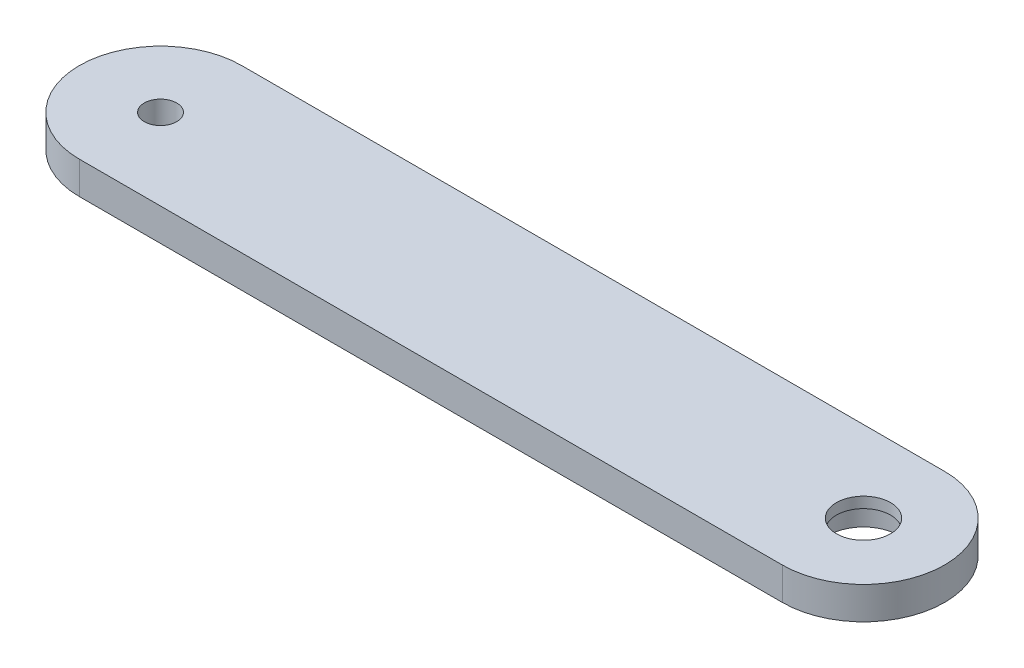
ISO-10303-21;
HEADER;
FILE_DESCRIPTION(('STEP AP214'),'2;1');
FILE_NAME('part.step','',(''),(''),'','','');
FILE_SCHEMA(('AUTOMOTIVE_DESIGN { 1 0 10303 214 1 1 1 1 }'));
ENDSEC;
DATA;
#1=APPLICATION_CONTEXT('core data for automotive mechanical design processes');
#2=APPLICATION_PROTOCOL_DEFINITION('international standard','automotive_design',2000,#1);
#3=PRODUCT_CONTEXT('',#1,'mechanical');
#4=PRODUCT('Part','Part','',(#3));
#5=PRODUCT_RELATED_PRODUCT_CATEGORY('part','',(#4));
#6=PRODUCT_DEFINITION_FORMATION('','',#4);
#7=PRODUCT_DEFINITION_CONTEXT('part definition',#1,'design');
#8=PRODUCT_DEFINITION('design','',#6,#7);
#9=PRODUCT_DEFINITION_SHAPE('','',#8);
#10=(LENGTH_UNIT() NAMED_UNIT(*) SI_UNIT(.MILLI.,.METRE.));
#11=(NAMED_UNIT(*) PLANE_ANGLE_UNIT() SI_UNIT($,.RADIAN.));
#12=(NAMED_UNIT(*) SI_UNIT($,.STERADIAN.) SOLID_ANGLE_UNIT());
#13=UNCERTAINTY_MEASURE_WITH_UNIT(LENGTH_MEASURE(1.E-05),#10,'distance_accuracy_value','');
#14=(GEOMETRIC_REPRESENTATION_CONTEXT(3) GLOBAL_UNCERTAINTY_ASSIGNED_CONTEXT((#13)) GLOBAL_UNIT_ASSIGNED_CONTEXT((#10,
#11,#12)) REPRESENTATION_CONTEXT('',''));
#15=CARTESIAN_POINT('',(0.,0.,0.));
#16=DIRECTION('',(0.,0.,1.));
#17=DIRECTION('',(1.,0.,0.));
#18=AXIS2_PLACEMENT_3D('',#15,#16,#17);
#19=CARTESIAN_POINT('',(123.5,6.,-13.5000000000001));
#20=DIRECTION('',(0.,-1.,0.));
#21=DIRECTION('',(0.,0.,-1.));
#22=AXIS2_PLACEMENT_3D('',#19,#20,#21);
#23=CYLINDRICAL_SURFACE('',#22,5.);
#24=CARTESIAN_POINT('',(123.5,6.,-13.5000000000001));
#25=DIRECTION('',(0.,1.,0.));
#26=DIRECTION('',(0.,0.,1.));
#27=AXIS2_PLACEMENT_3D('',#24,#25,#26);
#28=CIRCLE('',#27,5.);
#29=CARTESIAN_POINT('',(123.5,6.,-8.50000000000008));
#30=VERTEX_POINT('',#29);
#31=EDGE_CURVE('E137',#30,#30,#28,.T.);
#32=ORIENTED_EDGE('',*,*,#31,.T.);
#33=EDGE_LOOP('',(#32));
#34=FACE_BOUND('',#33,.T.);
#35=CARTESIAN_POINT('',(123.5,4.,-13.5000000000001));
#36=DIRECTION('',(0.,-1.,0.));
#37=DIRECTION('',(0.,0.,-1.));
#38=AXIS2_PLACEMENT_3D('',#35,#36,#37);
#39=CIRCLE('',#38,5.);
#40=CARTESIAN_POINT('',(123.5,4.,-18.5000000000001));
#41=VERTEX_POINT('',#40);
#42=EDGE_CURVE('E43',#41,#41,#39,.T.);
#43=ORIENTED_EDGE('',*,*,#42,.T.);
#44=EDGE_LOOP('',(#43));
#45=FACE_BOUND('',#44,.T.);
#46=ADVANCED_FACE('F39',(#34,#45),#23,.F.);
#47=CARTESIAN_POINT('',(123.5,6.,-13.5000000000001));
#48=DIRECTION('',(0.,1.,0.));
#49=DIRECTION('',(0.,0.,1.));
#50=AXIS2_PLACEMENT_3D('',#47,#48,#49);
#51=PLANE('',#50);
#52=CARTESIAN_POINT('',(-6.50000000000001,6.,-13.5));
#53=DIRECTION('',(0.,1.,0.));
#54=DIRECTION('',(0.,0.,1.));
#55=AXIS2_PLACEMENT_3D('',#52,#53,#54);
#56=CIRCLE('',#55,3.);
#57=CARTESIAN_POINT('',(-6.50000000000001,6.,-10.5));
#58=VERTEX_POINT('',#57);
#59=EDGE_CURVE('E115',#58,#58,#56,.T.);
#60=ORIENTED_EDGE('',*,*,#59,.F.);
#61=EDGE_LOOP('',(#60));
#62=FACE_BOUND('',#61,.T.);
#63=CARTESIAN_POINT('',(123.5,6.,-13.5000000000001));
#64=DIRECTION('',(0.,1.,0.));
#65=DIRECTION('',(0.,0.,1.));
#66=AXIS2_PLACEMENT_3D('',#63,#64,#65);
#67=CIRCLE('',#66,15.);
#68=CARTESIAN_POINT('',(123.5,6.,1.49999999999992));
#69=VERTEX_POINT('',#68);
#70=CARTESIAN_POINT('',(123.5,6.,-28.5000000000001));
#71=VERTEX_POINT('',#70);
#72=EDGE_CURVE('E94',#69,#71,#67,.T.);
#73=ORIENTED_EDGE('',*,*,#72,.T.);
#74=DIRECTION('',(-1.,0.,0.));
#75=VECTOR('',#74,1.);
#76=CARTESIAN_POINT('',(-6.50000000000001,6.,-28.5));
#77=LINE('',#76,#75);
#78=CARTESIAN_POINT('',(-6.50000000000001,6.,-28.5));
#79=VERTEX_POINT('',#78);
#80=EDGE_CURVE('E88',#71,#79,#77,.T.);
#81=ORIENTED_EDGE('',*,*,#80,.T.);
#82=CARTESIAN_POINT('',(-6.50000000000001,6.,-13.5));
#83=DIRECTION('',(0.,1.,0.));
#84=DIRECTION('',(0.,0.,1.));
#85=AXIS2_PLACEMENT_3D('',#82,#83,#84);
#86=CIRCLE('',#85,15.);
#87=CARTESIAN_POINT('',(-6.5,6.,1.5));
#88=VERTEX_POINT('',#87);
#89=EDGE_CURVE('E92',#79,#88,#86,.T.);
#90=ORIENTED_EDGE('',*,*,#89,.T.);
#91=DIRECTION('',(1.,0.,0.));
#92=VECTOR('',#91,1.);
#93=CARTESIAN_POINT('',(-6.5,6.,1.5));
#94=LINE('',#93,#92);
#95=EDGE_CURVE('E58',#88,#69,#94,.T.);
#96=ORIENTED_EDGE('',*,*,#95,.T.);
#97=EDGE_LOOP('',(#73,#81,#90,#96));
#98=FACE_BOUND('',#97,.T.);
#99=ORIENTED_EDGE('',*,*,#31,.F.);
#100=EDGE_LOOP('',(#99));
#101=FACE_BOUND('',#100,.T.);
#102=ADVANCED_FACE('F89',(#62,#98,#101),#51,.T.);
#103=CARTESIAN_POINT('',(123.5,0.,-13.5000000000001));
#104=DIRECTION('',(0.,1.,0.));
#105=DIRECTION('',(0.,0.,1.));
#106=AXIS2_PLACEMENT_3D('',#103,#104,#105);
#107=PLANE('',#106);
#108=CARTESIAN_POINT('',(123.5,0.,-13.5000000000001));
#109=DIRECTION('',(0.,-1.,0.));
#110=DIRECTION('',(0.,0.,-1.));
#111=AXIS2_PLACEMENT_3D('',#108,#109,#110);
#112=CIRCLE('',#111,6.5);
#113=CARTESIAN_POINT('',(123.5,0.,-20.0000000000001));
#114=VERTEX_POINT('',#113);
#115=EDGE_CURVE('E144',#114,#114,#112,.T.);
#116=ORIENTED_EDGE('',*,*,#115,.F.);
#117=EDGE_LOOP('',(#116));
#118=FACE_BOUND('',#117,.T.);
#119=CARTESIAN_POINT('',(123.5,0.,-13.5000000000001));
#120=DIRECTION('',(0.,1.,0.));
#121=DIRECTION('',(0.,0.,1.));
#122=AXIS2_PLACEMENT_3D('',#119,#120,#121);
#123=CIRCLE('',#122,15.);
#124=CARTESIAN_POINT('',(123.5,0.,1.49999999999992));
#125=VERTEX_POINT('',#124);
#126=CARTESIAN_POINT('',(123.5,0.,-28.5000000000001));
#127=VERTEX_POINT('',#126);
#128=EDGE_CURVE('E111',#125,#127,#123,.T.);
#129=ORIENTED_EDGE('',*,*,#128,.F.);
#130=DIRECTION('',(1.,0.,0.));
#131=VECTOR('',#130,1.);
#132=CARTESIAN_POINT('',(-6.5,0.,1.5));
#133=LINE('',#132,#131);
#134=CARTESIAN_POINT('',(-6.5,0.,1.5));
#135=VERTEX_POINT('',#134);
#136=EDGE_CURVE('E81',#135,#125,#133,.T.);
#137=ORIENTED_EDGE('',*,*,#136,.F.);
#138=CARTESIAN_POINT('',(-6.50000000000001,0.,-13.5));
#139=DIRECTION('',(0.,1.,0.));
#140=DIRECTION('',(0.,0.,1.));
#141=AXIS2_PLACEMENT_3D('',#138,#139,#140);
#142=CIRCLE('',#141,15.);
#143=CARTESIAN_POINT('',(-6.50000000000001,0.,-28.5));
#144=VERTEX_POINT('',#143);
#145=EDGE_CURVE('E75',#144,#135,#142,.T.);
#146=ORIENTED_EDGE('',*,*,#145,.F.);
#147=DIRECTION('',(-1.,0.,0.));
#148=VECTOR('',#147,1.);
#149=CARTESIAN_POINT('',(-6.50000000000001,0.,-28.5));
#150=LINE('',#149,#148);
#151=EDGE_CURVE('E99',#127,#144,#150,.T.);
#152=ORIENTED_EDGE('',*,*,#151,.F.);
#153=EDGE_LOOP('',(#129,#137,#146,#152));
#154=FACE_BOUND('',#153,.T.);
#155=CARTESIAN_POINT('',(-6.50000000000001,0.,-13.5));
#156=DIRECTION('',(0.,1.,0.));
#157=DIRECTION('',(0.,0.,1.));
#158=AXIS2_PLACEMENT_3D('',#155,#156,#157);
#159=CIRCLE('',#158,3.);
#160=CARTESIAN_POINT('',(-6.50000000000001,0.,-10.5));
#161=VERTEX_POINT('',#160);
#162=EDGE_CURVE('E133',#161,#161,#159,.T.);
#163=ORIENTED_EDGE('',*,*,#162,.T.);
#164=EDGE_LOOP('',(#163));
#165=FACE_BOUND('',#164,.T.);
#166=ADVANCED_FACE('F128',(#118,#154,#165),#107,.F.);
#167=CARTESIAN_POINT('',(123.5,6.,-13.5000000000001));
#168=DIRECTION('',(0.,-1.,0.));
#169=DIRECTION('',(0.,0.,-1.));
#170=AXIS2_PLACEMENT_3D('',#167,#168,#169);
#171=CYLINDRICAL_SURFACE('',#170,15.);
#172=ORIENTED_EDGE('',*,*,#128,.T.);
#173=DIRECTION('',(0.,-1.,0.));
#174=VECTOR('',#173,1.);
#175=CARTESIAN_POINT('',(123.5,6.,-28.5000000000001));
#176=LINE('',#175,#174);
#177=EDGE_CURVE('E11',#71,#127,#176,.T.);
#178=ORIENTED_EDGE('',*,*,#177,.F.);
#179=ORIENTED_EDGE('',*,*,#72,.F.);
#180=DIRECTION('',(0.,-1.,0.));
#181=VECTOR('',#180,1.);
#182=CARTESIAN_POINT('',(123.5,6.,1.49999999999992));
#183=LINE('',#182,#181);
#184=EDGE_CURVE('E107',#69,#125,#183,.T.);
#185=ORIENTED_EDGE('',*,*,#184,.T.);
#186=EDGE_LOOP('',(#172,#178,#179,#185));
#187=FACE_BOUND('',#186,.T.);
#188=ADVANCED_FACE('F41',(#187),#171,.T.);
#189=CARTESIAN_POINT('',(-6.50000000000001,6.,-28.5));
#190=DIRECTION('',(0.,0.,1.));
#191=DIRECTION('',(1.,0.,0.));
#192=AXIS2_PLACEMENT_3D('',#189,#190,#191);
#193=PLANE('',#192);
#194=ORIENTED_EDGE('',*,*,#151,.T.);
#195=DIRECTION('',(0.,-1.,0.));
#196=VECTOR('',#195,1.);
#197=CARTESIAN_POINT('',(-6.50000000000001,6.,-28.5));
#198=LINE('',#197,#196);
#199=EDGE_CURVE('E50',#79,#144,#198,.T.);
#200=ORIENTED_EDGE('',*,*,#199,.F.);
#201=ORIENTED_EDGE('',*,*,#80,.F.);
#202=ORIENTED_EDGE('',*,*,#177,.T.);
#203=EDGE_LOOP('',(#194,#200,#201,#202));
#204=FACE_BOUND('',#203,.T.);
#205=ADVANCED_FACE('F98',(#204),#193,.F.);
#206=CARTESIAN_POINT('',(-6.50000000000001,6.,-13.5));
#207=DIRECTION('',(0.,-1.,0.));
#208=DIRECTION('',(0.,0.,-1.));
#209=AXIS2_PLACEMENT_3D('',#206,#207,#208);
#210=CYLINDRICAL_SURFACE('',#209,15.);
#211=ORIENTED_EDGE('',*,*,#145,.T.);
#212=DIRECTION('',(0.,-1.,0.));
#213=VECTOR('',#212,1.);
#214=CARTESIAN_POINT('',(-6.5,6.,1.5));
#215=LINE('',#214,#213);
#216=EDGE_CURVE('E101',#88,#135,#215,.T.);
#217=ORIENTED_EDGE('',*,*,#216,.F.);
#218=ORIENTED_EDGE('',*,*,#89,.F.);
#219=ORIENTED_EDGE('',*,*,#199,.T.);
#220=EDGE_LOOP('',(#211,#217,#218,#219));
#221=FACE_BOUND('',#220,.T.);
#222=ADVANCED_FACE('F103',(#221),#210,.T.);
#223=CARTESIAN_POINT('',(-6.5,6.,1.5));
#224=DIRECTION('',(0.,0.,-1.));
#225=DIRECTION('',(-1.,0.,0.));
#226=AXIS2_PLACEMENT_3D('',#223,#224,#225);
#227=PLANE('',#226);
#228=ORIENTED_EDGE('',*,*,#136,.T.);
#229=ORIENTED_EDGE('',*,*,#184,.F.);
#230=ORIENTED_EDGE('',*,*,#95,.F.);
#231=ORIENTED_EDGE('',*,*,#216,.T.);
#232=EDGE_LOOP('',(#228,#229,#230,#231));
#233=FACE_BOUND('',#232,.T.);
#234=ADVANCED_FACE('F125',(#233),#227,.F.);
#235=CARTESIAN_POINT('',(-6.50000000000001,6.,-13.5));
#236=DIRECTION('',(0.,-1.,0.));
#237=DIRECTION('',(0.,0.,-1.));
#238=AXIS2_PLACEMENT_3D('',#235,#236,#237);
#239=CYLINDRICAL_SURFACE('',#238,3.);
#240=ORIENTED_EDGE('',*,*,#59,.T.);
#241=EDGE_LOOP('',(#240));
#242=FACE_BOUND('',#241,.T.);
#243=ORIENTED_EDGE('',*,*,#162,.F.);
#244=EDGE_LOOP('',(#243));
#245=FACE_BOUND('',#244,.T.);
#246=ADVANCED_FACE('F165',(#242,#245),#239,.F.);
#247=CARTESIAN_POINT('',(123.5,4.,-13.5000000000001));
#248=DIRECTION('',(0.,-1.,0.));
#249=DIRECTION('',(0.,0.,-1.));
#250=AXIS2_PLACEMENT_3D('',#247,#248,#249);
#251=CYLINDRICAL_SURFACE('',#250,6.5);
#252=CARTESIAN_POINT('',(123.5,4.,-13.5000000000001));
#253=DIRECTION('',(0.,-1.,0.));
#254=DIRECTION('',(0.,0.,-1.));
#255=AXIS2_PLACEMENT_3D('',#252,#253,#254);
#256=CIRCLE('',#255,6.5);
#257=CARTESIAN_POINT('',(123.5,4.,-20.0000000000001));
#258=VERTEX_POINT('',#257);
#259=EDGE_CURVE('E148',#258,#258,#256,.T.);
#260=ORIENTED_EDGE('',*,*,#259,.F.);
#261=EDGE_LOOP('',(#260));
#262=FACE_BOUND('',#261,.T.);
#263=ORIENTED_EDGE('',*,*,#115,.T.);
#264=EDGE_LOOP('',(#263));
#265=FACE_BOUND('',#264,.T.);
#266=ADVANCED_FACE('F160',(#262,#265),#251,.F.);
#267=CARTESIAN_POINT('',(123.5,4.,-13.5000000000001));
#268=DIRECTION('',(0.,-1.,0.));
#269=DIRECTION('',(0.,0.,-1.));
#270=AXIS2_PLACEMENT_3D('',#267,#268,#269);
#271=PLANE('',#270);
#272=ORIENTED_EDGE('',*,*,#42,.F.);
#273=EDGE_LOOP('',(#272));
#274=FACE_BOUND('',#273,.T.);
#275=ORIENTED_EDGE('',*,*,#259,.T.);
#276=EDGE_LOOP('',(#275));
#277=FACE_BOUND('',#276,.T.);
#278=ADVANCED_FACE('F158',(#274,#277),#271,.T.);
#279=CLOSED_SHELL('',(#46,#102,#166,#188,#205,#222,#234,#246,#266,#278));
#280=MANIFOLD_SOLID_BREP('B2',#279);
#281=ADVANCED_BREP_SHAPE_REPRESENTATION('',(#18,#280),#14);
#282=SHAPE_DEFINITION_REPRESENTATION(#9,#281);
ENDSEC;
END-ISO-10303-21;
